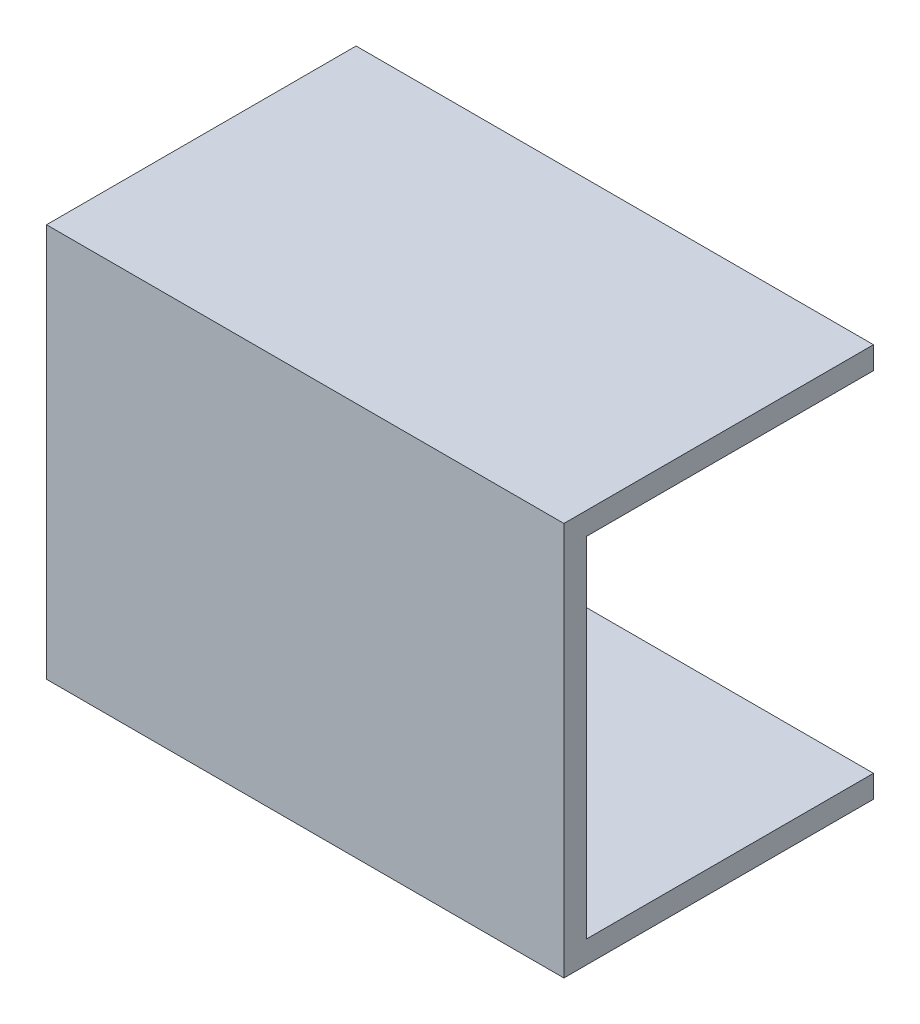
ISO-10303-21;
HEADER;
FILE_DESCRIPTION(('STEP AP214'),'2;1');
FILE_NAME('part.step','',(''),(''),'','','');
FILE_SCHEMA(('AUTOMOTIVE_DESIGN { 1 0 10303 214 1 1 1 1 }'));
ENDSEC;
DATA;
#1=APPLICATION_CONTEXT('core data for automotive mechanical design processes');
#2=APPLICATION_PROTOCOL_DEFINITION('international standard','automotive_design',2000,#1);
#3=PRODUCT_CONTEXT('',#1,'mechanical');
#4=PRODUCT('Part','Part','',(#3));
#5=PRODUCT_RELATED_PRODUCT_CATEGORY('part','',(#4));
#6=PRODUCT_DEFINITION_FORMATION('','',#4);
#7=PRODUCT_DEFINITION_CONTEXT('part definition',#1,'design');
#8=PRODUCT_DEFINITION('design','',#6,#7);
#9=PRODUCT_DEFINITION_SHAPE('','',#8);
#10=(LENGTH_UNIT() NAMED_UNIT(*) SI_UNIT(.MILLI.,.METRE.));
#11=(NAMED_UNIT(*) PLANE_ANGLE_UNIT() SI_UNIT($,.RADIAN.));
#12=(NAMED_UNIT(*) SI_UNIT($,.STERADIAN.) SOLID_ANGLE_UNIT());
#13=UNCERTAINTY_MEASURE_WITH_UNIT(LENGTH_MEASURE(1.E-05),#10,'distance_accuracy_value','');
#14=(GEOMETRIC_REPRESENTATION_CONTEXT(3) GLOBAL_UNCERTAINTY_ASSIGNED_CONTEXT((#13)) GLOBAL_UNIT_ASSIGNED_CONTEXT((#10,
#11,#12)) REPRESENTATION_CONTEXT('',''));
#15=CARTESIAN_POINT('',(0.,0.,0.));
#16=DIRECTION('',(0.,0.,1.));
#17=DIRECTION('',(1.,0.,0.));
#18=AXIS2_PLACEMENT_3D('',#15,#16,#17);
#19=CARTESIAN_POINT('',(222.297,-47.39,28.52475196363));
#20=DIRECTION('',(0.,-1.,0.));
#21=DIRECTION('',(0.,0.,-1.));
#22=AXIS2_PLACEMENT_3D('',#19,#20,#21);
#23=PLANE('',#22);
#24=DIRECTION('',(0.,0.,-1.));
#25=VECTOR('',#24,1.);
#26=CARTESIAN_POINT('',(268.297,-47.39,28.52475196363));
#27=LINE('',#26,#25);
#28=CARTESIAN_POINT('',(268.297,-47.39,28.52475196363));
#29=VERTEX_POINT('',#28);
#30=CARTESIAN_POINT('',(268.297,-47.39,3.));
#31=VERTEX_POINT('',#30);
#32=EDGE_CURVE('E129',#29,#31,#27,.T.);
#33=ORIENTED_EDGE('',*,*,#32,.T.);
#34=DIRECTION('',(1.,0.,0.));
#35=VECTOR('',#34,1.);
#36=CARTESIAN_POINT('',(222.297,-47.39,3.));
#37=LINE('',#36,#35);
#38=CARTESIAN_POINT('',(222.297,-47.39,3.));
#39=VERTEX_POINT('',#38);
#40=EDGE_CURVE('E11',#39,#31,#37,.T.);
#41=ORIENTED_EDGE('',*,*,#40,.F.);
#42=DIRECTION('',(0.,0.,-1.));
#43=VECTOR('',#42,1.);
#44=CARTESIAN_POINT('',(222.297,-47.39,28.52475196363));
#45=LINE('',#44,#43);
#46=CARTESIAN_POINT('',(222.297,-47.39,28.52475196363));
#47=VERTEX_POINT('',#46);
#48=EDGE_CURVE('E87',#47,#39,#45,.T.);
#49=ORIENTED_EDGE('',*,*,#48,.F.);
#50=DIRECTION('',(1.,0.,0.));
#51=VECTOR('',#50,1.);
#52=CARTESIAN_POINT('',(222.297,-47.39,28.52475196363));
#53=LINE('',#52,#51);
#54=EDGE_CURVE('E128',#47,#29,#53,.T.);
#55=ORIENTED_EDGE('',*,*,#54,.T.);
#56=EDGE_LOOP('',(#33,#41,#49,#55));
#57=FACE_BOUND('',#56,.T.);
#58=ADVANCED_FACE('F32',(#57),#23,.F.);
#59=CARTESIAN_POINT('',(222.297,-49.39,3.));
#60=DIRECTION('',(0.,0.,-1.));
#61=DIRECTION('',(0.,1.,0.));
#62=AXIS2_PLACEMENT_3D('',#59,#60,#61);
#63=PLANE('',#62);
#64=DIRECTION('',(0.,1.,0.));
#65=VECTOR('',#64,1.);
#66=CARTESIAN_POINT('',(268.297,-49.39,3.));
#67=LINE('',#66,#65);
#68=CARTESIAN_POINT('',(268.297,-49.39,3.));
#69=VERTEX_POINT('',#68);
#70=EDGE_CURVE('E132',#69,#31,#67,.T.);
#71=ORIENTED_EDGE('',*,*,#70,.F.);
#72=DIRECTION('',(1.,0.,0.));
#73=VECTOR('',#72,1.);
#74=CARTESIAN_POINT('',(222.297,-49.39,3.));
#75=LINE('',#74,#73);
#76=CARTESIAN_POINT('',(222.297,-49.39,3.));
#77=VERTEX_POINT('',#76);
#78=EDGE_CURVE('E40',#77,#69,#75,.T.);
#79=ORIENTED_EDGE('',*,*,#78,.F.);
#80=DIRECTION('',(0.,1.,0.));
#81=VECTOR('',#80,1.);
#82=CARTESIAN_POINT('',(222.297,-49.39,3.));
#83=LINE('',#82,#81);
#84=EDGE_CURVE('E171',#77,#39,#83,.T.);
#85=ORIENTED_EDGE('',*,*,#84,.T.);
#86=ORIENTED_EDGE('',*,*,#40,.T.);
#87=EDGE_LOOP('',(#71,#79,#85,#86));
#88=FACE_BOUND('',#87,.T.);
#89=ADVANCED_FACE('F162',(#88),#63,.T.);
#90=CARTESIAN_POINT('',(222.297,-49.39,28.52475196363));
#91=DIRECTION('',(0.,-1.,0.));
#92=DIRECTION('',(0.,0.,-1.));
#93=AXIS2_PLACEMENT_3D('',#90,#91,#92);
#94=PLANE('',#93);
#95=DIRECTION('',(0.,0.,1.));
#96=VECTOR('',#95,1.);
#97=CARTESIAN_POINT('',(268.297,-49.39,28.52475196363));
#98=LINE('',#97,#96);
#99=CARTESIAN_POINT('',(268.297,-49.39,30.52475196363));
#100=VERTEX_POINT('',#99);
#101=EDGE_CURVE('E135',#100,#69,#98,.F.);
#102=ORIENTED_EDGE('',*,*,#101,.F.);
#103=DIRECTION('',(1.,0.,0.));
#104=VECTOR('',#103,1.);
#105=CARTESIAN_POINT('',(222.297,-49.39,30.52475196363));
#106=LINE('',#105,#104);
#107=CARTESIAN_POINT('',(222.297,-49.39,30.52475196363));
#108=VERTEX_POINT('',#107);
#109=EDGE_CURVE('E152',#108,#100,#106,.T.);
#110=ORIENTED_EDGE('',*,*,#109,.F.);
#111=DIRECTION('',(0.,0.,1.));
#112=VECTOR('',#111,1.);
#113=CARTESIAN_POINT('',(222.297,-49.39,28.52475196363));
#114=LINE('',#113,#112);
#115=EDGE_CURVE('E159',#108,#77,#114,.F.);
#116=ORIENTED_EDGE('',*,*,#115,.T.);
#117=ORIENTED_EDGE('',*,*,#78,.T.);
#118=EDGE_LOOP('',(#102,#110,#116,#117));
#119=FACE_BOUND('',#118,.T.);
#120=ADVANCED_FACE('F157',(#119),#94,.T.);
#121=CARTESIAN_POINT('',(222.297,-16.39,30.52475196363));
#122=DIRECTION('',(0.,0.,1.));
#123=DIRECTION('',(0.,-1.,0.));
#124=AXIS2_PLACEMENT_3D('',#121,#122,#123);
#125=PLANE('',#124);
#126=DIRECTION('',(0.,-1.,0.));
#127=VECTOR('',#126,1.);
#128=CARTESIAN_POINT('',(268.297,-16.39,30.52475196363));
#129=LINE('',#128,#127);
#130=CARTESIAN_POINT('',(268.297,-14.39,30.52475196363));
#131=VERTEX_POINT('',#130);
#132=EDGE_CURVE('E138',#131,#100,#129,.T.);
#133=ORIENTED_EDGE('',*,*,#132,.F.);
#134=DIRECTION('',(1.,0.,0.));
#135=VECTOR('',#134,1.);
#136=CARTESIAN_POINT('',(222.297,-14.39,30.52475196363));
#137=LINE('',#136,#135);
#138=CARTESIAN_POINT('',(222.297,-14.39,30.52475196363));
#139=VERTEX_POINT('',#138);
#140=EDGE_CURVE('E150',#139,#131,#137,.T.);
#141=ORIENTED_EDGE('',*,*,#140,.F.);
#142=DIRECTION('',(0.,-1.,0.));
#143=VECTOR('',#142,1.);
#144=CARTESIAN_POINT('',(222.297,-16.39,30.52475196363));
#145=LINE('',#144,#143);
#146=EDGE_CURVE('E123',#139,#108,#145,.T.);
#147=ORIENTED_EDGE('',*,*,#146,.T.);
#148=ORIENTED_EDGE('',*,*,#109,.T.);
#149=EDGE_LOOP('',(#133,#141,#147,#148));
#150=FACE_BOUND('',#149,.T.);
#151=ADVANCED_FACE('F169',(#150),#125,.T.);
#152=CARTESIAN_POINT('',(222.297,-14.39,3.));
#153=DIRECTION('',(0.,1.,0.));
#154=DIRECTION('',(0.,0.,1.));
#155=AXIS2_PLACEMENT_3D('',#152,#153,#154);
#156=PLANE('',#155);
#157=DIRECTION('',(0.,0.,1.));
#158=VECTOR('',#157,1.);
#159=CARTESIAN_POINT('',(268.297,-14.39,3.));
#160=LINE('',#159,#158);
#161=CARTESIAN_POINT('',(268.297,-14.39,3.));
#162=VERTEX_POINT('',#161);
#163=EDGE_CURVE('E141',#162,#131,#160,.T.);
#164=ORIENTED_EDGE('',*,*,#163,.F.);
#165=DIRECTION('',(1.,0.,0.));
#166=VECTOR('',#165,1.);
#167=CARTESIAN_POINT('',(222.297,-14.39,3.));
#168=LINE('',#167,#166);
#169=CARTESIAN_POINT('',(222.297,-14.39,3.));
#170=VERTEX_POINT('',#169);
#171=EDGE_CURVE('E111',#170,#162,#168,.T.);
#172=ORIENTED_EDGE('',*,*,#171,.F.);
#173=DIRECTION('',(0.,0.,1.));
#174=VECTOR('',#173,1.);
#175=CARTESIAN_POINT('',(222.297,-14.39,3.));
#176=LINE('',#175,#174);
#177=EDGE_CURVE('E121',#170,#139,#176,.T.);
#178=ORIENTED_EDGE('',*,*,#177,.T.);
#179=ORIENTED_EDGE('',*,*,#140,.T.);
#180=EDGE_LOOP('',(#164,#172,#178,#179));
#181=FACE_BOUND('',#180,.T.);
#182=ADVANCED_FACE('F176',(#181),#156,.T.);
#183=CARTESIAN_POINT('',(222.297,-16.39,3.));
#184=DIRECTION('',(0.,0.,-1.));
#185=DIRECTION('',(-1.,0.,0.));
#186=AXIS2_PLACEMENT_3D('',#183,#184,#185);
#187=PLANE('',#186);
#188=DIRECTION('',(0.,1.,0.));
#189=VECTOR('',#188,1.);
#190=CARTESIAN_POINT('',(268.297,-16.39,3.));
#191=LINE('',#190,#189);
#192=CARTESIAN_POINT('',(268.297,-16.39,3.));
#193=VERTEX_POINT('',#192);
#194=EDGE_CURVE('E110',#193,#162,#191,.T.);
#195=ORIENTED_EDGE('',*,*,#194,.F.);
#196=DIRECTION('',(1.,0.,0.));
#197=VECTOR('',#196,1.);
#198=CARTESIAN_POINT('',(222.297,-16.39,3.));
#199=LINE('',#198,#197);
#200=CARTESIAN_POINT('',(222.297,-16.39,3.));
#201=VERTEX_POINT('',#200);
#202=EDGE_CURVE('E104',#201,#193,#199,.T.);
#203=ORIENTED_EDGE('',*,*,#202,.F.);
#204=DIRECTION('',(0.,1.,0.));
#205=VECTOR('',#204,1.);
#206=CARTESIAN_POINT('',(222.297,-16.39,3.));
#207=LINE('',#206,#205);
#208=EDGE_CURVE('E108',#201,#170,#207,.T.);
#209=ORIENTED_EDGE('',*,*,#208,.T.);
#210=ORIENTED_EDGE('',*,*,#171,.T.);
#211=EDGE_LOOP('',(#195,#203,#209,#210));
#212=FACE_BOUND('',#211,.T.);
#213=ADVANCED_FACE('F106',(#212),#187,.T.);
#214=CARTESIAN_POINT('',(222.297,-16.39,3.));
#215=DIRECTION('',(0.,1.,0.));
#216=DIRECTION('',(0.,0.,1.));
#217=AXIS2_PLACEMENT_3D('',#214,#215,#216);
#218=PLANE('',#217);
#219=DIRECTION('',(0.,0.,1.));
#220=VECTOR('',#219,1.);
#221=CARTESIAN_POINT('',(268.297,-16.39,3.));
#222=LINE('',#221,#220);
#223=CARTESIAN_POINT('',(268.297,-16.39,28.52475196363));
#224=VERTEX_POINT('',#223);
#225=EDGE_CURVE('E75',#193,#224,#222,.T.);
#226=ORIENTED_EDGE('',*,*,#225,.T.);
#227=DIRECTION('',(1.,0.,0.));
#228=VECTOR('',#227,1.);
#229=CARTESIAN_POINT('',(222.297,-16.39,28.52475196363));
#230=LINE('',#229,#228);
#231=CARTESIAN_POINT('',(222.297,-16.39,28.52475196363));
#232=VERTEX_POINT('',#231);
#233=EDGE_CURVE('E112',#232,#224,#230,.T.);
#234=ORIENTED_EDGE('',*,*,#233,.F.);
#235=DIRECTION('',(0.,0.,1.));
#236=VECTOR('',#235,1.);
#237=CARTESIAN_POINT('',(222.297,-16.39,3.));
#238=LINE('',#237,#236);
#239=EDGE_CURVE('E114',#201,#232,#238,.T.);
#240=ORIENTED_EDGE('',*,*,#239,.F.);
#241=ORIENTED_EDGE('',*,*,#202,.T.);
#242=EDGE_LOOP('',(#226,#234,#240,#241));
#243=FACE_BOUND('',#242,.T.);
#244=ADVANCED_FACE('F115',(#243),#218,.F.);
#245=CARTESIAN_POINT('',(222.297,-16.39,28.52475196363));
#246=DIRECTION('',(0.,0.,1.));
#247=DIRECTION('',(0.,-1.,0.));
#248=AXIS2_PLACEMENT_3D('',#245,#246,#247);
#249=PLANE('',#248);
#250=DIRECTION('',(0.,-1.,0.));
#251=VECTOR('',#250,1.);
#252=CARTESIAN_POINT('',(268.297,-16.39,28.52475196363));
#253=LINE('',#252,#251);
#254=EDGE_CURVE('E81',#224,#29,#253,.T.);
#255=ORIENTED_EDGE('',*,*,#254,.T.);
#256=ORIENTED_EDGE('',*,*,#54,.F.);
#257=DIRECTION('',(0.,-1.,0.));
#258=VECTOR('',#257,1.);
#259=CARTESIAN_POINT('',(222.297,-16.39,28.52475196363));
#260=LINE('',#259,#258);
#261=EDGE_CURVE('E48',#232,#47,#260,.T.);
#262=ORIENTED_EDGE('',*,*,#261,.F.);
#263=ORIENTED_EDGE('',*,*,#233,.T.);
#264=EDGE_LOOP('',(#255,#256,#262,#263));
#265=FACE_BOUND('',#264,.T.);
#266=ADVANCED_FACE('F178',(#265),#249,.F.);
#267=CARTESIAN_POINT('',(222.297,0.,0.));
#268=DIRECTION('',(1.,0.,0.));
#269=DIRECTION('',(0.,0.,-1.));
#270=AXIS2_PLACEMENT_3D('',#267,#268,#269);
#271=PLANE('',#270);
#272=ORIENTED_EDGE('',*,*,#48,.T.);
#273=ORIENTED_EDGE('',*,*,#84,.F.);
#274=ORIENTED_EDGE('',*,*,#115,.F.);
#275=ORIENTED_EDGE('',*,*,#146,.F.);
#276=ORIENTED_EDGE('',*,*,#177,.F.);
#277=ORIENTED_EDGE('',*,*,#208,.F.);
#278=ORIENTED_EDGE('',*,*,#239,.T.);
#279=ORIENTED_EDGE('',*,*,#261,.T.);
#280=EDGE_LOOP('',(#272,#273,#274,#275,#276,#277,#278,#279));
#281=FACE_BOUND('',#280,.T.);
#282=ADVANCED_FACE('F118',(#281),#271,.F.);
#283=CARTESIAN_POINT('',(268.297,0.,0.));
#284=DIRECTION('',(1.,0.,0.));
#285=DIRECTION('',(0.,0.,-1.));
#286=AXIS2_PLACEMENT_3D('',#283,#284,#285);
#287=PLANE('',#286);
#288=ORIENTED_EDGE('',*,*,#32,.F.);
#289=ORIENTED_EDGE('',*,*,#254,.F.);
#290=ORIENTED_EDGE('',*,*,#225,.F.);
#291=ORIENTED_EDGE('',*,*,#194,.T.);
#292=ORIENTED_EDGE('',*,*,#163,.T.);
#293=ORIENTED_EDGE('',*,*,#132,.T.);
#294=ORIENTED_EDGE('',*,*,#101,.T.);
#295=ORIENTED_EDGE('',*,*,#70,.T.);
#296=EDGE_LOOP('',(#288,#289,#290,#291,#292,#293,#294,#295));
#297=FACE_BOUND('',#296,.T.);
#298=ADVANCED_FACE('F165',(#297),#287,.T.);
#299=CLOSED_SHELL('',(#58,#89,#120,#151,#182,#213,#244,#266,#282,#298));
#300=MANIFOLD_SOLID_BREP('B2',#299);
#301=ADVANCED_BREP_SHAPE_REPRESENTATION('',(#18,#300),#14);
#302=SHAPE_DEFINITION_REPRESENTATION(#9,#301);
ENDSEC;
END-ISO-10303-21;
